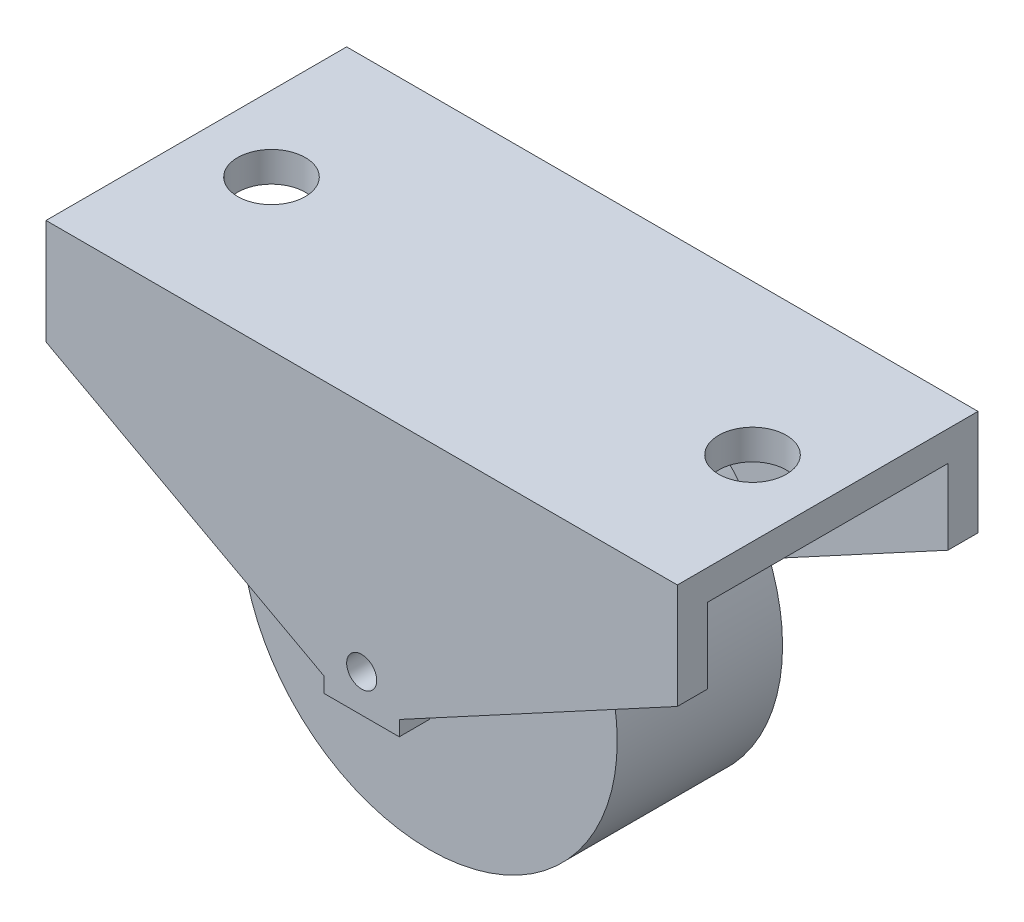
ISO-10303-21;
HEADER;
FILE_DESCRIPTION(('STEP AP214'),'2;1');
FILE_NAME('part.step','',(''),(''),'','','');
FILE_SCHEMA(('AUTOMOTIVE_DESIGN { 1 0 10303 214 1 1 1 1 }'));
ENDSEC;
DATA;
#1=APPLICATION_CONTEXT('core data for automotive mechanical design processes');
#2=APPLICATION_PROTOCOL_DEFINITION('international standard','automotive_design',2000,#1);
#3=PRODUCT_CONTEXT('',#1,'mechanical');
#4=PRODUCT('Part','Part','',(#3));
#5=PRODUCT_RELATED_PRODUCT_CATEGORY('part','',(#4));
#6=PRODUCT_DEFINITION_FORMATION('','',#4);
#7=PRODUCT_DEFINITION_CONTEXT('part definition',#1,'design');
#8=PRODUCT_DEFINITION('design','',#6,#7);
#9=PRODUCT_DEFINITION_SHAPE('','',#8);
#10=(LENGTH_UNIT() NAMED_UNIT(*) SI_UNIT(.MILLI.,.METRE.));
#11=(NAMED_UNIT(*) PLANE_ANGLE_UNIT() SI_UNIT($,.RADIAN.));
#12=(NAMED_UNIT(*) SI_UNIT($,.STERADIAN.) SOLID_ANGLE_UNIT());
#13=UNCERTAINTY_MEASURE_WITH_UNIT(LENGTH_MEASURE(1.E-05),#10,'distance_accuracy_value','');
#14=(GEOMETRIC_REPRESENTATION_CONTEXT(3) GLOBAL_UNCERTAINTY_ASSIGNED_CONTEXT((#13)) GLOBAL_UNIT_ASSIGNED_CONTEXT((#10,
#11,#12)) REPRESENTATION_CONTEXT('',''));
#15=CARTESIAN_POINT('',(0.,0.,0.));
#16=DIRECTION('',(0.,0.,1.));
#17=DIRECTION('',(1.,0.,0.));
#18=AXIS2_PLACEMENT_3D('',#15,#16,#17);
#19=CARTESIAN_POINT('',(0.,-13.5,5.5));
#20=DIRECTION('',(0.,0.,-1.));
#21=DIRECTION('',(-1.,0.,0.));
#22=AXIS2_PLACEMENT_3D('',#19,#20,#21);
#23=CYLINDRICAL_SURFACE('',#22,12.5);
#24=CARTESIAN_POINT('',(0.,-13.5,5.5));
#25=DIRECTION('',(0.,0.,1.));
#26=DIRECTION('',(1.,0.,0.));
#27=AXIS2_PLACEMENT_3D('',#24,#25,#26);
#28=CIRCLE('',#27,12.5);
#29=CARTESIAN_POINT('',(12.5,-13.5,5.5));
#30=VERTEX_POINT('',#29);
#31=EDGE_CURVE('E11',#30,#30,#28,.T.);
#32=ORIENTED_EDGE('',*,*,#31,.F.);
#33=EDGE_LOOP('',(#32));
#34=FACE_BOUND('',#33,.T.);
#35=CARTESIAN_POINT('',(0.,-13.5,-5.5));
#36=DIRECTION('',(0.,0.,1.));
#37=DIRECTION('',(1.,0.,0.));
#38=AXIS2_PLACEMENT_3D('',#35,#36,#37);
#39=CIRCLE('',#38,12.5);
#40=CARTESIAN_POINT('',(12.5,-13.5,-5.5));
#41=VERTEX_POINT('',#40);
#42=EDGE_CURVE('E52',#41,#41,#39,.T.);
#43=ORIENTED_EDGE('',*,*,#42,.T.);
#44=EDGE_LOOP('',(#43));
#45=FACE_BOUND('',#44,.T.);
#46=ADVANCED_FACE('F49',(#34,#45),#23,.T.);
#47=CARTESIAN_POINT('',(0.,-13.5,5.5));
#48=DIRECTION('',(0.,0.,1.));
#49=DIRECTION('',(1.,0.,0.));
#50=AXIS2_PLACEMENT_3D('',#47,#48,#49);
#51=PLANE('',#50);
#52=ORIENTED_EDGE('',*,*,#31,.T.);
#53=EDGE_LOOP('',(#52));
#54=FACE_BOUND('',#53,.T.);
#55=ADVANCED_FACE('F64',(#54),#51,.T.);
#56=CARTESIAN_POINT('',(0.,-13.5,-5.5));
#57=DIRECTION('',(0.,0.,1.));
#58=DIRECTION('',(1.,0.,0.));
#59=AXIS2_PLACEMENT_3D('',#56,#57,#58);
#60=PLANE('',#59);
#61=ORIENTED_EDGE('',*,*,#42,.F.);
#62=EDGE_LOOP('',(#61));
#63=FACE_BOUND('',#62,.T.);
#64=ADVANCED_FACE('F62',(#63),#60,.F.);
#65=CLOSED_SHELL('',(#46,#55,#64));
#66=MANIFOLD_SOLID_BREP('B2',#65);
#67=CARTESIAN_POINT('',(0.,0.,0.));
#68=DIRECTION('',(0.,-1.,0.));
#69=DIRECTION('',(0.,0.,-1.));
#70=AXIS2_PLACEMENT_3D('',#67,#68,#69);
#71=PLANE('',#70);
#72=DIRECTION('',(-1.,0.,0.));
#73=VECTOR('',#72,1.);
#74=CARTESIAN_POINT('',(-21.,0.,-8.));
#75=LINE('',#74,#73);
#76=CARTESIAN_POINT('',(21.,0.,-8.));
#77=VERTEX_POINT('',#76);
#78=CARTESIAN_POINT('',(-21.,0.,-8.));
#79=VERTEX_POINT('',#78);
#80=EDGE_CURVE('E106',#77,#79,#75,.T.);
#81=ORIENTED_EDGE('',*,*,#80,.F.);
#82=DIRECTION('',(0.,0.,-1.));
#83=VECTOR('',#82,1.);
#84=CARTESIAN_POINT('',(21.,0.,10.));
#85=LINE('',#84,#83);
#86=CARTESIAN_POINT('',(21.,0.,8.));
#87=VERTEX_POINT('',#86);
#88=EDGE_CURVE('E330',#87,#77,#85,.T.);
#89=ORIENTED_EDGE('',*,*,#88,.F.);
#90=DIRECTION('',(-1.,0.,0.));
#91=VECTOR('',#90,1.);
#92=CARTESIAN_POINT('',(-21.,0.,8.));
#93=LINE('',#92,#91);
#94=CARTESIAN_POINT('',(-21.,0.,8.));
#95=VERTEX_POINT('',#94);
#96=EDGE_CURVE('E290',#87,#95,#93,.T.);
#97=ORIENTED_EDGE('',*,*,#96,.T.);
#98=DIRECTION('',(0.,0.,1.));
#99=VECTOR('',#98,1.);
#100=CARTESIAN_POINT('',(-21.,0.,10.));
#101=LINE('',#100,#99);
#102=EDGE_CURVE('E113',#79,#95,#101,.T.);
#103=ORIENTED_EDGE('',*,*,#102,.F.);
#104=EDGE_LOOP('',(#81,#89,#97,#103));
#105=FACE_BOUND('',#104,.T.);
#106=CARTESIAN_POINT('',(-16.,0.,0.));
#107=DIRECTION('',(0.,1.,0.));
#108=DIRECTION('',(0.,0.,1.));
#109=AXIS2_PLACEMENT_3D('',#106,#107,#108);
#110=CIRCLE('',#109,2.25);
#111=CARTESIAN_POINT('',(-16.,0.,2.25));
#112=VERTEX_POINT('',#111);
#113=EDGE_CURVE('E324',#112,#112,#110,.T.);
#114=ORIENTED_EDGE('',*,*,#113,.T.);
#115=EDGE_LOOP('',(#114));
#116=FACE_BOUND('',#115,.T.);
#117=CARTESIAN_POINT('',(16.,0.,0.));
#118=DIRECTION('',(0.,1.,0.));
#119=DIRECTION('',(0.,0.,1.));
#120=AXIS2_PLACEMENT_3D('',#117,#118,#119);
#121=CIRCLE('',#120,2.25);
#122=CARTESIAN_POINT('',(16.,0.,2.25));
#123=VERTEX_POINT('',#122);
#124=EDGE_CURVE('E310',#123,#123,#121,.T.);
#125=ORIENTED_EDGE('',*,*,#124,.T.);
#126=EDGE_LOOP('',(#125));
#127=FACE_BOUND('',#126,.T.);
#128=ADVANCED_FACE('F90',(#105,#116,#127),#71,.T.);
#129=CARTESIAN_POINT('',(0.,2.,0.));
#130=DIRECTION('',(0.,-1.,0.));
#131=DIRECTION('',(0.,0.,-1.));
#132=AXIS2_PLACEMENT_3D('',#129,#130,#131);
#133=PLANE('',#132);
#134=DIRECTION('',(0.,0.,-1.));
#135=VECTOR('',#134,1.);
#136=CARTESIAN_POINT('',(21.,2.,10.));
#137=LINE('',#136,#135);
#138=CARTESIAN_POINT('',(21.,2.,10.));
#139=VERTEX_POINT('',#138);
#140=CARTESIAN_POINT('',(21.,2.,-10.));
#141=VERTEX_POINT('',#140);
#142=EDGE_CURVE('E333',#139,#141,#137,.T.);
#143=ORIENTED_EDGE('',*,*,#142,.T.);
#144=DIRECTION('',(-1.,0.,0.));
#145=VECTOR('',#144,1.);
#146=CARTESIAN_POINT('',(-21.,2.,-10.));
#147=LINE('',#146,#145);
#148=CARTESIAN_POINT('',(-21.,2.,-10.));
#149=VERTEX_POINT('',#148);
#150=EDGE_CURVE('E336',#141,#149,#147,.T.);
#151=ORIENTED_EDGE('',*,*,#150,.T.);
#152=DIRECTION('',(0.,0.,1.));
#153=VECTOR('',#152,1.);
#154=CARTESIAN_POINT('',(-21.,2.,10.));
#155=LINE('',#154,#153);
#156=CARTESIAN_POINT('',(-21.,2.,10.));
#157=VERTEX_POINT('',#156);
#158=EDGE_CURVE('E209',#149,#157,#155,.T.);
#159=ORIENTED_EDGE('',*,*,#158,.T.);
#160=DIRECTION('',(1.,0.,0.));
#161=VECTOR('',#160,1.);
#162=CARTESIAN_POINT('',(-21.,2.,10.));
#163=LINE('',#162,#161);
#164=EDGE_CURVE('E339',#157,#139,#163,.T.);
#165=ORIENTED_EDGE('',*,*,#164,.T.);
#166=EDGE_LOOP('',(#143,#151,#159,#165));
#167=FACE_BOUND('',#166,.T.);
#168=CARTESIAN_POINT('',(-16.,2.,0.));
#169=DIRECTION('',(0.,1.,0.));
#170=DIRECTION('',(0.,0.,1.));
#171=AXIS2_PLACEMENT_3D('',#168,#169,#170);
#172=CIRCLE('',#171,2.25);
#173=CARTESIAN_POINT('',(-16.,2.,2.25));
#174=VERTEX_POINT('',#173);
#175=EDGE_CURVE('E327',#174,#174,#172,.T.);
#176=ORIENTED_EDGE('',*,*,#175,.F.);
#177=EDGE_LOOP('',(#176));
#178=FACE_BOUND('',#177,.T.);
#179=CARTESIAN_POINT('',(16.,2.,0.));
#180=DIRECTION('',(0.,1.,0.));
#181=DIRECTION('',(0.,0.,1.));
#182=AXIS2_PLACEMENT_3D('',#179,#180,#181);
#183=CIRCLE('',#182,2.25);
#184=CARTESIAN_POINT('',(16.,2.,2.25));
#185=VERTEX_POINT('',#184);
#186=EDGE_CURVE('E321',#185,#185,#183,.T.);
#187=ORIENTED_EDGE('',*,*,#186,.F.);
#188=EDGE_LOOP('',(#187));
#189=FACE_BOUND('',#188,.T.);
#190=ADVANCED_FACE('F375',(#167,#178,#189),#133,.F.);
#191=CARTESIAN_POINT('',(21.,2.,10.));
#192=DIRECTION('',(-1.,0.,0.));
#193=DIRECTION('',(0.,0.,1.));
#194=AXIS2_PLACEMENT_3D('',#191,#192,#193);
#195=PLANE('',#194);
#196=DIRECTION('',(0.,-1.,0.));
#197=VECTOR('',#196,1.);
#198=CARTESIAN_POINT('',(21.,2.,10.));
#199=LINE('',#198,#197);
#200=CARTESIAN_POINT('',(21.,-5.,10.));
#201=VERTEX_POINT('',#200);
#202=EDGE_CURVE('E341',#139,#201,#199,.T.);
#203=ORIENTED_EDGE('',*,*,#202,.T.);
#204=DIRECTION('',(0.,0.,1.));
#205=VECTOR('',#204,1.);
#206=CARTESIAN_POINT('',(21.,-5.,8.));
#207=LINE('',#206,#205);
#208=CARTESIAN_POINT('',(21.,-5.,8.));
#209=VERTEX_POINT('',#208);
#210=EDGE_CURVE('E307',#209,#201,#207,.T.);
#211=ORIENTED_EDGE('',*,*,#210,.F.);
#212=DIRECTION('',(0.,1.,0.));
#213=VECTOR('',#212,1.);
#214=CARTESIAN_POINT('',(21.,0.,8.));
#215=LINE('',#214,#213);
#216=EDGE_CURVE('E288',#209,#87,#215,.T.);
#217=ORIENTED_EDGE('',*,*,#216,.T.);
#218=ORIENTED_EDGE('',*,*,#88,.T.);
#219=DIRECTION('',(0.,1.,0.));
#220=VECTOR('',#219,1.);
#221=CARTESIAN_POINT('',(21.,0.,-8.));
#222=LINE('',#221,#220);
#223=CARTESIAN_POINT('',(21.,-5.,-8.));
#224=VERTEX_POINT('',#223);
#225=EDGE_CURVE('E231',#224,#77,#222,.T.);
#226=ORIENTED_EDGE('',*,*,#225,.F.);
#227=DIRECTION('',(0.,0.,1.));
#228=VECTOR('',#227,1.);
#229=CARTESIAN_POINT('',(21.,-5.,-10.));
#230=LINE('',#229,#228);
#231=CARTESIAN_POINT('',(21.,-5.,-10.));
#232=VERTEX_POINT('',#231);
#233=EDGE_CURVE('E260',#232,#224,#230,.T.);
#234=ORIENTED_EDGE('',*,*,#233,.F.);
#235=DIRECTION('',(0.,-1.,0.));
#236=VECTOR('',#235,1.);
#237=CARTESIAN_POINT('',(21.,2.,-10.));
#238=LINE('',#237,#236);
#239=EDGE_CURVE('E47',#141,#232,#238,.T.);
#240=ORIENTED_EDGE('',*,*,#239,.F.);
#241=ORIENTED_EDGE('',*,*,#142,.F.);
#242=EDGE_LOOP('',(#203,#211,#217,#218,#226,#234,#240,#241));
#243=FACE_BOUND('',#242,.T.);
#244=ADVANCED_FACE('F92',(#243),#195,.F.);
#245=CARTESIAN_POINT('',(-21.,2.,-10.));
#246=DIRECTION('',(0.,0.,1.));
#247=DIRECTION('',(1.,0.,0.));
#248=AXIS2_PLACEMENT_3D('',#245,#246,#247);
#249=PLANE('',#248);
#250=CARTESIAN_POINT('',(0.,-13.5,-10.));
#251=DIRECTION('',(0.,0.,1.));
#252=DIRECTION('',(1.,0.,0.));
#253=AXIS2_PLACEMENT_3D('',#250,#251,#252);
#254=CIRCLE('',#253,1.);
#255=CARTESIAN_POINT('',(1.,-13.5,-10.));
#256=VERTEX_POINT('',#255);
#257=EDGE_CURVE('E434',#256,#256,#254,.T.);
#258=ORIENTED_EDGE('',*,*,#257,.T.);
#259=EDGE_LOOP('',(#258));
#260=FACE_BOUND('',#259,.T.);
#261=ORIENTED_EDGE('',*,*,#239,.T.);
#262=DIRECTION('',(0.879706513576127,0.475517034365474,0.));
#263=VECTOR('',#262,1.);
#264=CARTESIAN_POINT('',(2.5,-15.,-10.));
#265=LINE('',#264,#263);
#266=CARTESIAN_POINT('',(2.5,-15.,-10.));
#267=VERTEX_POINT('',#266);
#268=EDGE_CURVE('E221',#267,#232,#265,.T.);
#269=ORIENTED_EDGE('',*,*,#268,.F.);
#270=DIRECTION('',(0.,1.,0.));
#271=VECTOR('',#270,1.);
#272=CARTESIAN_POINT('',(2.5,-16.,-10.));
#273=LINE('',#272,#271);
#274=CARTESIAN_POINT('',(2.5,-16.,-10.));
#275=VERTEX_POINT('',#274);
#276=EDGE_CURVE('E239',#275,#267,#273,.T.);
#277=ORIENTED_EDGE('',*,*,#276,.F.);
#278=DIRECTION('',(1.,0.,0.));
#279=VECTOR('',#278,1.);
#280=CARTESIAN_POINT('',(-2.5,-16.,-10.));
#281=LINE('',#280,#279);
#282=CARTESIAN_POINT('',(-2.5,-16.,-10.));
#283=VERTEX_POINT('',#282);
#284=EDGE_CURVE('E229',#283,#275,#281,.T.);
#285=ORIENTED_EDGE('',*,*,#284,.F.);
#286=DIRECTION('',(0.,-1.,0.));
#287=VECTOR('',#286,1.);
#288=CARTESIAN_POINT('',(-2.5,-16.,-10.));
#289=LINE('',#288,#287);
#290=CARTESIAN_POINT('',(-2.5,-15.,-10.));
#291=VERTEX_POINT('',#290);
#292=EDGE_CURVE('E227',#291,#283,#289,.T.);
#293=ORIENTED_EDGE('',*,*,#292,.F.);
#294=DIRECTION('',(0.879706513576127,-0.475517034365474,0.));
#295=VECTOR('',#294,1.);
#296=CARTESIAN_POINT('',(-21.,-5.,-10.));
#297=LINE('',#296,#295);
#298=CARTESIAN_POINT('',(-21.,-5.,-10.));
#299=VERTEX_POINT('',#298);
#300=EDGE_CURVE('E217',#299,#291,#297,.T.);
#301=ORIENTED_EDGE('',*,*,#300,.F.);
#302=DIRECTION('',(0.,-1.,0.));
#303=VECTOR('',#302,1.);
#304=CARTESIAN_POINT('',(-21.,2.,-10.));
#305=LINE('',#304,#303);
#306=EDGE_CURVE('E99',#149,#299,#305,.T.);
#307=ORIENTED_EDGE('',*,*,#306,.F.);
#308=ORIENTED_EDGE('',*,*,#150,.F.);
#309=EDGE_LOOP('',(#261,#269,#277,#285,#293,#301,#307,#308));
#310=FACE_BOUND('',#309,.T.);
#311=ADVANCED_FACE('F224',(#260,#310),#249,.F.);
#312=CARTESIAN_POINT('',(-21.,2.,10.));
#313=DIRECTION('',(1.,0.,0.));
#314=DIRECTION('',(0.,0.,-1.));
#315=AXIS2_PLACEMENT_3D('',#312,#313,#314);
#316=PLANE('',#315);
#317=ORIENTED_EDGE('',*,*,#306,.T.);
#318=DIRECTION('',(0.,0.,1.));
#319=VECTOR('',#318,1.);
#320=CARTESIAN_POINT('',(-21.,-5.,-10.));
#321=LINE('',#320,#319);
#322=CARTESIAN_POINT('',(-21.,-5.,-8.));
#323=VERTEX_POINT('',#322);
#324=EDGE_CURVE('E206',#299,#323,#321,.T.);
#325=ORIENTED_EDGE('',*,*,#324,.T.);
#326=DIRECTION('',(0.,-1.,0.));
#327=VECTOR('',#326,1.);
#328=CARTESIAN_POINT('',(-21.,0.,-8.));
#329=LINE('',#328,#327);
#330=EDGE_CURVE('E244',#79,#323,#329,.T.);
#331=ORIENTED_EDGE('',*,*,#330,.F.);
#332=ORIENTED_EDGE('',*,*,#102,.T.);
#333=DIRECTION('',(0.,-1.,0.));
#334=VECTOR('',#333,1.);
#335=CARTESIAN_POINT('',(-21.,0.,8.));
#336=LINE('',#335,#334);
#337=CARTESIAN_POINT('',(-21.,-5.,8.));
#338=VERTEX_POINT('',#337);
#339=EDGE_CURVE('E270',#95,#338,#336,.T.);
#340=ORIENTED_EDGE('',*,*,#339,.T.);
#341=DIRECTION('',(0.,0.,1.));
#342=VECTOR('',#341,1.);
#343=CARTESIAN_POINT('',(-21.,-5.,8.));
#344=LINE('',#343,#342);
#345=CARTESIAN_POINT('',(-21.,-5.,10.));
#346=VERTEX_POINT('',#345);
#347=EDGE_CURVE('E293',#338,#346,#344,.T.);
#348=ORIENTED_EDGE('',*,*,#347,.T.);
#349=DIRECTION('',(0.,-1.,0.));
#350=VECTOR('',#349,1.);
#351=CARTESIAN_POINT('',(-21.,2.,10.));
#352=LINE('',#351,#350);
#353=EDGE_CURVE('E212',#157,#346,#352,.T.);
#354=ORIENTED_EDGE('',*,*,#353,.F.);
#355=ORIENTED_EDGE('',*,*,#158,.F.);
#356=EDGE_LOOP('',(#317,#325,#331,#332,#340,#348,#354,#355));
#357=FACE_BOUND('',#356,.T.);
#358=ADVANCED_FACE('F205',(#357),#316,.F.);
#359=CARTESIAN_POINT('',(-21.,2.,10.));
#360=DIRECTION('',(0.,0.,-1.));
#361=DIRECTION('',(-1.,0.,0.));
#362=AXIS2_PLACEMENT_3D('',#359,#360,#361);
#363=PLANE('',#362);
#364=CARTESIAN_POINT('',(0.,-13.5,10.));
#365=DIRECTION('',(0.,0.,1.));
#366=DIRECTION('',(1.,0.,0.));
#367=AXIS2_PLACEMENT_3D('',#364,#365,#366);
#368=CIRCLE('',#367,1.);
#369=CARTESIAN_POINT('',(1.,-13.5,10.));
#370=VERTEX_POINT('',#369);
#371=EDGE_CURVE('E436',#370,#370,#368,.T.);
#372=ORIENTED_EDGE('',*,*,#371,.F.);
#373=EDGE_LOOP('',(#372));
#374=FACE_BOUND('',#373,.T.);
#375=ORIENTED_EDGE('',*,*,#353,.T.);
#376=DIRECTION('',(0.879706513576127,-0.475517034365474,0.));
#377=VECTOR('',#376,1.);
#378=CARTESIAN_POINT('',(-21.,-5.,10.));
#379=LINE('',#378,#377);
#380=CARTESIAN_POINT('',(-2.5,-15.,10.));
#381=VERTEX_POINT('',#380);
#382=EDGE_CURVE('E262',#346,#381,#379,.T.);
#383=ORIENTED_EDGE('',*,*,#382,.T.);
#384=DIRECTION('',(0.,-1.,0.));
#385=VECTOR('',#384,1.);
#386=CARTESIAN_POINT('',(-2.5,-16.,10.));
#387=LINE('',#386,#385);
#388=CARTESIAN_POINT('',(-2.5,-16.,10.));
#389=VERTEX_POINT('',#388);
#390=EDGE_CURVE('E296',#381,#389,#387,.T.);
#391=ORIENTED_EDGE('',*,*,#390,.T.);
#392=DIRECTION('',(1.,0.,0.));
#393=VECTOR('',#392,1.);
#394=CARTESIAN_POINT('',(-2.5,-16.,10.));
#395=LINE('',#394,#393);
#396=CARTESIAN_POINT('',(2.5,-16.,10.));
#397=VERTEX_POINT('',#396);
#398=EDGE_CURVE('E299',#389,#397,#395,.T.);
#399=ORIENTED_EDGE('',*,*,#398,.T.);
#400=DIRECTION('',(0.,1.,0.));
#401=VECTOR('',#400,1.);
#402=CARTESIAN_POINT('',(2.5,-16.,10.));
#403=LINE('',#402,#401);
#404=CARTESIAN_POINT('',(2.5,-15.,10.));
#405=VERTEX_POINT('',#404);
#406=EDGE_CURVE('E302',#397,#405,#403,.T.);
#407=ORIENTED_EDGE('',*,*,#406,.T.);
#408=DIRECTION('',(0.879706513576127,0.475517034365474,0.));
#409=VECTOR('',#408,1.);
#410=CARTESIAN_POINT('',(2.5,-15.,10.));
#411=LINE('',#410,#409);
#412=EDGE_CURVE('E273',#405,#201,#411,.T.);
#413=ORIENTED_EDGE('',*,*,#412,.T.);
#414=ORIENTED_EDGE('',*,*,#202,.F.);
#415=ORIENTED_EDGE('',*,*,#164,.F.);
#416=EDGE_LOOP('',(#375,#383,#391,#399,#407,#413,#414,#415));
#417=FACE_BOUND('',#416,.T.);
#418=ADVANCED_FACE('F348',(#374,#417),#363,.F.);
#419=CARTESIAN_POINT('',(-16.,2.,0.));
#420=DIRECTION('',(0.,-1.,0.));
#421=DIRECTION('',(0.,0.,-1.));
#422=AXIS2_PLACEMENT_3D('',#419,#420,#421);
#423=CYLINDRICAL_SURFACE('',#422,2.25);
#424=ORIENTED_EDGE('',*,*,#175,.T.);
#425=EDGE_LOOP('',(#424));
#426=FACE_BOUND('',#425,.T.);
#427=ORIENTED_EDGE('',*,*,#113,.F.);
#428=EDGE_LOOP('',(#427));
#429=FACE_BOUND('',#428,.T.);
#430=ADVANCED_FACE('F424',(#426,#429),#423,.F.);
#431=CARTESIAN_POINT('',(16.,2.,0.));
#432=DIRECTION('',(0.,-1.,0.));
#433=DIRECTION('',(0.,0.,-1.));
#434=AXIS2_PLACEMENT_3D('',#431,#432,#433);
#435=CYLINDRICAL_SURFACE('',#434,2.25);
#436=ORIENTED_EDGE('',*,*,#186,.T.);
#437=EDGE_LOOP('',(#436));
#438=FACE_BOUND('',#437,.T.);
#439=ORIENTED_EDGE('',*,*,#124,.F.);
#440=EDGE_LOOP('',(#439));
#441=FACE_BOUND('',#440,.T.);
#442=ADVANCED_FACE('F537',(#438,#441),#435,.F.);
#443=CARTESIAN_POINT('',(2.5,-15.,8.));
#444=DIRECTION('',(0.475517034365474,-0.879706513576127,0.));
#445=DIRECTION('',(0.879706513576127,0.475517034365474,0.));
#446=AXIS2_PLACEMENT_3D('',#443,#444,#445);
#447=PLANE('',#446);
#448=ORIENTED_EDGE('',*,*,#412,.F.);
#449=DIRECTION('',(0.,0.,1.));
#450=VECTOR('',#449,1.);
#451=CARTESIAN_POINT('',(2.5,-15.,8.));
#452=LINE('',#451,#450);
#453=CARTESIAN_POINT('',(2.5,-15.,8.));
#454=VERTEX_POINT('',#453);
#455=EDGE_CURVE('E311',#454,#405,#452,.T.);
#456=ORIENTED_EDGE('',*,*,#455,.F.);
#457=DIRECTION('',(0.879706513576127,0.475517034365474,0.));
#458=VECTOR('',#457,1.);
#459=CARTESIAN_POINT('',(2.5,-15.,8.));
#460=LINE('',#459,#458);
#461=EDGE_CURVE('E285',#454,#209,#460,.T.);
#462=ORIENTED_EDGE('',*,*,#461,.T.);
#463=ORIENTED_EDGE('',*,*,#210,.T.);
#464=EDGE_LOOP('',(#448,#456,#462,#463));
#465=FACE_BOUND('',#464,.T.);
#466=ADVANCED_FACE('F369',(#465),#447,.T.);
#467=CARTESIAN_POINT('',(2.5,-16.,8.));
#468=DIRECTION('',(1.,0.,0.));
#469=DIRECTION('',(0.,0.,-1.));
#470=AXIS2_PLACEMENT_3D('',#467,#468,#469);
#471=PLANE('',#470);
#472=ORIENTED_EDGE('',*,*,#406,.F.);
#473=DIRECTION('',(0.,0.,1.));
#474=VECTOR('',#473,1.);
#475=CARTESIAN_POINT('',(2.5,-16.,8.));
#476=LINE('',#475,#474);
#477=CARTESIAN_POINT('',(2.5,-16.,8.));
#478=VERTEX_POINT('',#477);
#479=EDGE_CURVE('E313',#478,#397,#476,.T.);
#480=ORIENTED_EDGE('',*,*,#479,.F.);
#481=DIRECTION('',(0.,1.,0.));
#482=VECTOR('',#481,1.);
#483=CARTESIAN_POINT('',(2.5,-16.,8.));
#484=LINE('',#483,#482);
#485=EDGE_CURVE('E282',#478,#454,#484,.T.);
#486=ORIENTED_EDGE('',*,*,#485,.T.);
#487=ORIENTED_EDGE('',*,*,#455,.T.);
#488=EDGE_LOOP('',(#472,#480,#486,#487));
#489=FACE_BOUND('',#488,.T.);
#490=ADVANCED_FACE('F365',(#489),#471,.T.);
#491=CARTESIAN_POINT('',(-2.5,-16.,8.));
#492=DIRECTION('',(0.,-1.,0.));
#493=DIRECTION('',(0.,0.,-1.));
#494=AXIS2_PLACEMENT_3D('',#491,#492,#493);
#495=PLANE('',#494);
#496=ORIENTED_EDGE('',*,*,#398,.F.);
#497=DIRECTION('',(0.,0.,1.));
#498=VECTOR('',#497,1.);
#499=CARTESIAN_POINT('',(-2.5,-16.,8.));
#500=LINE('',#499,#498);
#501=CARTESIAN_POINT('',(-2.5,-16.,8.));
#502=VERTEX_POINT('',#501);
#503=EDGE_CURVE('E315',#502,#389,#500,.T.);
#504=ORIENTED_EDGE('',*,*,#503,.F.);
#505=DIRECTION('',(1.,0.,0.));
#506=VECTOR('',#505,1.);
#507=CARTESIAN_POINT('',(-2.5,-16.,8.));
#508=LINE('',#507,#506);
#509=EDGE_CURVE('E279',#502,#478,#508,.T.);
#510=ORIENTED_EDGE('',*,*,#509,.T.);
#511=ORIENTED_EDGE('',*,*,#479,.T.);
#512=EDGE_LOOP('',(#496,#504,#510,#511));
#513=FACE_BOUND('',#512,.T.);
#514=ADVANCED_FACE('F361',(#513),#495,.T.);
#515=CARTESIAN_POINT('',(-2.5,-16.,8.));
#516=DIRECTION('',(-1.,0.,0.));
#517=DIRECTION('',(0.,-1.,0.));
#518=AXIS2_PLACEMENT_3D('',#515,#516,#517);
#519=PLANE('',#518);
#520=ORIENTED_EDGE('',*,*,#390,.F.);
#521=DIRECTION('',(0.,0.,1.));
#522=VECTOR('',#521,1.);
#523=CARTESIAN_POINT('',(-2.5,-15.,8.));
#524=LINE('',#523,#522);
#525=CARTESIAN_POINT('',(-2.5,-15.,8.));
#526=VERTEX_POINT('',#525);
#527=EDGE_CURVE('E317',#526,#381,#524,.T.);
#528=ORIENTED_EDGE('',*,*,#527,.F.);
#529=DIRECTION('',(0.,-1.,0.));
#530=VECTOR('',#529,1.);
#531=CARTESIAN_POINT('',(-2.5,-16.,8.));
#532=LINE('',#531,#530);
#533=EDGE_CURVE('E276',#526,#502,#532,.T.);
#534=ORIENTED_EDGE('',*,*,#533,.T.);
#535=ORIENTED_EDGE('',*,*,#503,.T.);
#536=EDGE_LOOP('',(#520,#528,#534,#535));
#537=FACE_BOUND('',#536,.T.);
#538=ADVANCED_FACE('F357',(#537),#519,.T.);
#539=CARTESIAN_POINT('',(-21.,-5.,8.));
#540=DIRECTION('',(-0.475517034365474,-0.879706513576127,0.));
#541=DIRECTION('',(0.879706513576127,-0.475517034365474,0.));
#542=AXIS2_PLACEMENT_3D('',#539,#540,#541);
#543=PLANE('',#542);
#544=ORIENTED_EDGE('',*,*,#382,.F.);
#545=ORIENTED_EDGE('',*,*,#347,.F.);
#546=DIRECTION('',(0.879706513576127,-0.475517034365474,0.));
#547=VECTOR('',#546,1.);
#548=CARTESIAN_POINT('',(-21.,-5.,8.));
#549=LINE('',#548,#547);
#550=EDGE_CURVE('E272',#338,#526,#549,.T.);
#551=ORIENTED_EDGE('',*,*,#550,.T.);
#552=ORIENTED_EDGE('',*,*,#527,.T.);
#553=EDGE_LOOP('',(#544,#545,#551,#552));
#554=FACE_BOUND('',#553,.T.);
#555=ADVANCED_FACE('F353',(#554),#543,.T.);
#556=CARTESIAN_POINT('',(0.,0.,8.));
#557=DIRECTION('',(0.,0.,1.));
#558=DIRECTION('',(1.,0.,0.));
#559=AXIS2_PLACEMENT_3D('',#556,#557,#558);
#560=PLANE('',#559);
#561=CARTESIAN_POINT('',(0.,-13.5,8.));
#562=DIRECTION('',(0.,0.,1.));
#563=DIRECTION('',(1.,0.,0.));
#564=AXIS2_PLACEMENT_3D('',#561,#562,#563);
#565=CIRCLE('',#564,1.);
#566=CARTESIAN_POINT('',(1.,-13.5,8.));
#567=VERTEX_POINT('',#566);
#568=EDGE_CURVE('E234',#567,#567,#565,.T.);
#569=ORIENTED_EDGE('',*,*,#568,.T.);
#570=EDGE_LOOP('',(#569));
#571=FACE_BOUND('',#570,.T.);
#572=ORIENTED_EDGE('',*,*,#339,.F.);
#573=ORIENTED_EDGE('',*,*,#96,.F.);
#574=ORIENTED_EDGE('',*,*,#216,.F.);
#575=ORIENTED_EDGE('',*,*,#461,.F.);
#576=ORIENTED_EDGE('',*,*,#485,.F.);
#577=ORIENTED_EDGE('',*,*,#509,.F.);
#578=ORIENTED_EDGE('',*,*,#533,.F.);
#579=ORIENTED_EDGE('',*,*,#550,.F.);
#580=EDGE_LOOP('',(#572,#573,#574,#575,#576,#577,#578,#579));
#581=FACE_BOUND('',#580,.T.);
#582=ADVANCED_FACE('F399',(#571,#581),#560,.F.);
#583=CARTESIAN_POINT('',(2.5,-15.,-10.));
#584=DIRECTION('',(0.475517034365474,-0.879706513576127,0.));
#585=DIRECTION('',(0.879706513576127,0.475517034365474,0.));
#586=AXIS2_PLACEMENT_3D('',#583,#584,#585);
#587=PLANE('',#586);
#588=DIRECTION('',(0.879706513576127,0.475517034365474,0.));
#589=VECTOR('',#588,1.);
#590=CARTESIAN_POINT('',(2.5,-15.,-8.));
#591=LINE('',#590,#589);
#592=CARTESIAN_POINT('',(2.5,-15.,-8.));
#593=VERTEX_POINT('',#592);
#594=EDGE_CURVE('E256',#593,#224,#591,.T.);
#595=ORIENTED_EDGE('',*,*,#594,.F.);
#596=DIRECTION('',(0.,0.,1.));
#597=VECTOR('',#596,1.);
#598=CARTESIAN_POINT('',(2.5,-15.,-10.));
#599=LINE('',#598,#597);
#600=EDGE_CURVE('E263',#267,#593,#599,.T.);
#601=ORIENTED_EDGE('',*,*,#600,.F.);
#602=ORIENTED_EDGE('',*,*,#268,.T.);
#603=ORIENTED_EDGE('',*,*,#233,.T.);
#604=EDGE_LOOP('',(#595,#601,#602,#603));
#605=FACE_BOUND('',#604,.T.);
#606=ADVANCED_FACE('F382',(#605),#587,.T.);
#607=CARTESIAN_POINT('',(2.5,-16.,-10.));
#608=DIRECTION('',(1.,0.,0.));
#609=DIRECTION('',(0.,0.,-1.));
#610=AXIS2_PLACEMENT_3D('',#607,#608,#609);
#611=PLANE('',#610);
#612=DIRECTION('',(0.,1.,0.));
#613=VECTOR('',#612,1.);
#614=CARTESIAN_POINT('',(2.5,-16.,-8.));
#615=LINE('',#614,#613);
#616=CARTESIAN_POINT('',(2.5,-16.,-8.));
#617=VERTEX_POINT('',#616);
#618=EDGE_CURVE('E253',#617,#593,#615,.T.);
#619=ORIENTED_EDGE('',*,*,#618,.F.);
#620=DIRECTION('',(0.,0.,1.));
#621=VECTOR('',#620,1.);
#622=CARTESIAN_POINT('',(2.5,-16.,-10.));
#623=LINE('',#622,#621);
#624=EDGE_CURVE('E265',#275,#617,#623,.T.);
#625=ORIENTED_EDGE('',*,*,#624,.F.);
#626=ORIENTED_EDGE('',*,*,#276,.T.);
#627=ORIENTED_EDGE('',*,*,#600,.T.);
#628=EDGE_LOOP('',(#619,#625,#626,#627));
#629=FACE_BOUND('',#628,.T.);
#630=ADVANCED_FACE('F385',(#629),#611,.T.);
#631=CARTESIAN_POINT('',(-2.5,-16.,-10.));
#632=DIRECTION('',(0.,-1.,0.));
#633=DIRECTION('',(0.,0.,-1.));
#634=AXIS2_PLACEMENT_3D('',#631,#632,#633);
#635=PLANE('',#634);
#636=DIRECTION('',(1.,0.,0.));
#637=VECTOR('',#636,1.);
#638=CARTESIAN_POINT('',(-2.5,-16.,-8.));
#639=LINE('',#638,#637);
#640=CARTESIAN_POINT('',(-2.5,-16.,-8.));
#641=VERTEX_POINT('',#640);
#642=EDGE_CURVE('E250',#641,#617,#639,.T.);
#643=ORIENTED_EDGE('',*,*,#642,.F.);
#644=DIRECTION('',(0.,0.,1.));
#645=VECTOR('',#644,1.);
#646=CARTESIAN_POINT('',(-2.5,-16.,-10.));
#647=LINE('',#646,#645);
#648=EDGE_CURVE('E267',#283,#641,#647,.T.);
#649=ORIENTED_EDGE('',*,*,#648,.F.);
#650=ORIENTED_EDGE('',*,*,#284,.T.);
#651=ORIENTED_EDGE('',*,*,#624,.T.);
#652=EDGE_LOOP('',(#643,#649,#650,#651));
#653=FACE_BOUND('',#652,.T.);
#654=ADVANCED_FACE('F388',(#653),#635,.T.);
#655=CARTESIAN_POINT('',(-2.5,-16.,-10.));
#656=DIRECTION('',(-1.,0.,0.));
#657=DIRECTION('',(0.,-1.,0.));
#658=AXIS2_PLACEMENT_3D('',#655,#656,#657);
#659=PLANE('',#658);
#660=DIRECTION('',(0.,-1.,0.));
#661=VECTOR('',#660,1.);
#662=CARTESIAN_POINT('',(-2.5,-16.,-8.));
#663=LINE('',#662,#661);
#664=CARTESIAN_POINT('',(-2.5,-15.,-8.));
#665=VERTEX_POINT('',#664);
#666=EDGE_CURVE('E247',#665,#641,#663,.T.);
#667=ORIENTED_EDGE('',*,*,#666,.F.);
#668=DIRECTION('',(0.,0.,1.));
#669=VECTOR('',#668,1.);
#670=CARTESIAN_POINT('',(-2.5,-15.,-10.));
#671=LINE('',#670,#669);
#672=EDGE_CURVE('E220',#291,#665,#671,.T.);
#673=ORIENTED_EDGE('',*,*,#672,.F.);
#674=ORIENTED_EDGE('',*,*,#292,.T.);
#675=ORIENTED_EDGE('',*,*,#648,.T.);
#676=EDGE_LOOP('',(#667,#673,#674,#675));
#677=FACE_BOUND('',#676,.T.);
#678=ADVANCED_FACE('F391',(#677),#659,.T.);
#679=CARTESIAN_POINT('',(-21.,-5.,-10.));
#680=DIRECTION('',(-0.475517034365474,-0.879706513576127,0.));
#681=DIRECTION('',(0.879706513576127,-0.475517034365474,0.));
#682=AXIS2_PLACEMENT_3D('',#679,#680,#681);
#683=PLANE('',#682);
#684=DIRECTION('',(0.879706513576127,-0.475517034365474,0.));
#685=VECTOR('',#684,1.);
#686=CARTESIAN_POINT('',(-21.,-5.,-8.));
#687=LINE('',#686,#685);
#688=EDGE_CURVE('E219',#323,#665,#687,.T.);
#689=ORIENTED_EDGE('',*,*,#688,.F.);
#690=ORIENTED_EDGE('',*,*,#324,.F.);
#691=ORIENTED_EDGE('',*,*,#300,.T.);
#692=ORIENTED_EDGE('',*,*,#672,.T.);
#693=EDGE_LOOP('',(#689,#690,#691,#692));
#694=FACE_BOUND('',#693,.T.);
#695=ADVANCED_FACE('F216',(#694),#683,.T.);
#696=CARTESIAN_POINT('',(0.,0.,-8.));
#697=DIRECTION('',(0.,0.,1.));
#698=DIRECTION('',(1.,0.,0.));
#699=AXIS2_PLACEMENT_3D('',#696,#697,#698);
#700=PLANE('',#699);
#701=CARTESIAN_POINT('',(0.,-13.5,-8.));
#702=DIRECTION('',(0.,0.,1.));
#703=DIRECTION('',(1.,0.,0.));
#704=AXIS2_PLACEMENT_3D('',#701,#702,#703);
#705=CIRCLE('',#704,1.);
#706=CARTESIAN_POINT('',(1.,-13.5,-8.));
#707=VERTEX_POINT('',#706);
#708=EDGE_CURVE('E94',#707,#707,#705,.T.);
#709=ORIENTED_EDGE('',*,*,#708,.F.);
#710=EDGE_LOOP('',(#709));
#711=FACE_BOUND('',#710,.T.);
#712=ORIENTED_EDGE('',*,*,#330,.T.);
#713=ORIENTED_EDGE('',*,*,#688,.T.);
#714=ORIENTED_EDGE('',*,*,#666,.T.);
#715=ORIENTED_EDGE('',*,*,#642,.T.);
#716=ORIENTED_EDGE('',*,*,#618,.T.);
#717=ORIENTED_EDGE('',*,*,#594,.T.);
#718=ORIENTED_EDGE('',*,*,#225,.T.);
#719=ORIENTED_EDGE('',*,*,#80,.T.);
#720=EDGE_LOOP('',(#712,#713,#714,#715,#716,#717,#718,#719));
#721=FACE_BOUND('',#720,.T.);
#722=ADVANCED_FACE('F392',(#711,#721),#700,.T.);
#723=CARTESIAN_POINT('',(0.,-13.5,-10.));
#724=DIRECTION('',(0.,0.,1.));
#725=DIRECTION('',(1.,0.,0.));
#726=AXIS2_PLACEMENT_3D('',#723,#724,#725);
#727=CYLINDRICAL_SURFACE('',#726,1.);
#728=ORIENTED_EDGE('',*,*,#708,.T.);
#729=EDGE_LOOP('',(#728));
#730=FACE_BOUND('',#729,.T.);
#731=ORIENTED_EDGE('',*,*,#257,.F.);
#732=EDGE_LOOP('',(#731));
#733=FACE_BOUND('',#732,.T.);
#734=ADVANCED_FACE('F445',(#730,#733),#727,.F.);
#735=ORIENTED_EDGE('',*,*,#371,.T.);
#736=EDGE_LOOP('',(#735));
#737=FACE_BOUND('',#736,.T.);
#738=ORIENTED_EDGE('',*,*,#568,.F.);
#739=EDGE_LOOP('',(#738));
#740=FACE_BOUND('',#739,.T.);
#741=ADVANCED_FACE('F442',(#737,#740),#727,.F.);
#742=CLOSED_SHELL('',(#128,#190,#244,#311,#358,#418,#430,#442,#466,#490,#514,#538,#555,#582,
#606,#630,#654,#678,#695,#722,#734,#741));
#743=MANIFOLD_SOLID_BREP('B6',#742);
#744=ADVANCED_BREP_SHAPE_REPRESENTATION('',(#18,#66,#743),#14);
#745=SHAPE_DEFINITION_REPRESENTATION(#9,#744);
ENDSEC;
END-ISO-10303-21;
